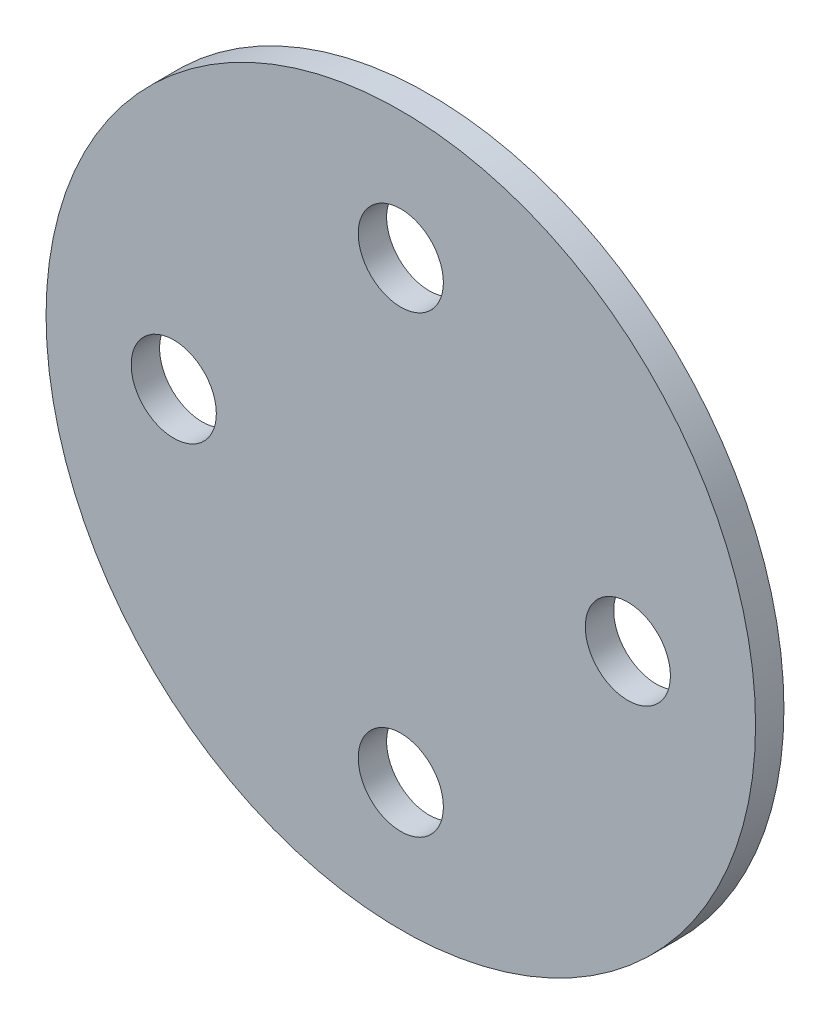
ISO-10303-21;
HEADER;
FILE_DESCRIPTION(('STEP AP214'),'2;1');
FILE_NAME('part.step','',(''),(''),'','','');
FILE_SCHEMA(('AUTOMOTIVE_DESIGN { 1 0 10303 214 1 1 1 1 }'));
ENDSEC;
DATA;
#1=APPLICATION_CONTEXT('core data for automotive mechanical design processes');
#2=APPLICATION_PROTOCOL_DEFINITION('international standard','automotive_design',2000,#1);
#3=PRODUCT_CONTEXT('',#1,'mechanical');
#4=PRODUCT('Part','Part','',(#3));
#5=PRODUCT_RELATED_PRODUCT_CATEGORY('part','',(#4));
#6=PRODUCT_DEFINITION_FORMATION('','',#4);
#7=PRODUCT_DEFINITION_CONTEXT('part definition',#1,'design');
#8=PRODUCT_DEFINITION('design','',#6,#7);
#9=PRODUCT_DEFINITION_SHAPE('','',#8);
#10=(LENGTH_UNIT() NAMED_UNIT(*) SI_UNIT(.MILLI.,.METRE.));
#11=(NAMED_UNIT(*) PLANE_ANGLE_UNIT() SI_UNIT($,.RADIAN.));
#12=(NAMED_UNIT(*) SI_UNIT($,.STERADIAN.) SOLID_ANGLE_UNIT());
#13=UNCERTAINTY_MEASURE_WITH_UNIT(LENGTH_MEASURE(1.E-05),#10,'distance_accuracy_value','');
#14=(GEOMETRIC_REPRESENTATION_CONTEXT(3) GLOBAL_UNCERTAINTY_ASSIGNED_CONTEXT((#13)) GLOBAL_UNIT_ASSIGNED_CONTEXT((#10,
#11,#12)) REPRESENTATION_CONTEXT('',''));
#15=CARTESIAN_POINT('',(0.,0.,0.));
#16=DIRECTION('',(0.,0.,1.));
#17=DIRECTION('',(1.,0.,0.));
#18=AXIS2_PLACEMENT_3D('',#15,#16,#17);
#19=CARTESIAN_POINT('',(8.,0.,1.));
#20=DIRECTION('',(0.,0.,-1.));
#21=DIRECTION('',(-1.,0.,0.));
#22=AXIS2_PLACEMENT_3D('',#19,#20,#21);
#23=CYLINDRICAL_SURFACE('',#22,1.5);
#24=CARTESIAN_POINT('',(8.,0.,1.));
#25=DIRECTION('',(0.,0.,1.));
#26=DIRECTION('',(1.,0.,0.));
#27=AXIS2_PLACEMENT_3D('',#24,#25,#26);
#28=CIRCLE('',#27,1.5);
#29=CARTESIAN_POINT('',(9.5,0.,1.));
#30=VERTEX_POINT('',#29);
#31=EDGE_CURVE('E47',#30,#30,#28,.T.);
#32=ORIENTED_EDGE('',*,*,#31,.T.);
#33=EDGE_LOOP('',(#32));
#34=FACE_BOUND('',#33,.T.);
#35=CARTESIAN_POINT('',(8.,0.,0.));
#36=DIRECTION('',(0.,0.,1.));
#37=DIRECTION('',(1.,0.,0.));
#38=AXIS2_PLACEMENT_3D('',#35,#36,#37);
#39=CIRCLE('',#38,1.5);
#40=CARTESIAN_POINT('',(9.5,0.,0.));
#41=VERTEX_POINT('',#40);
#42=EDGE_CURVE('E64',#41,#41,#39,.T.);
#43=ORIENTED_EDGE('',*,*,#42,.F.);
#44=EDGE_LOOP('',(#43));
#45=FACE_BOUND('',#44,.T.);
#46=ADVANCED_FACE('F39',(#34,#45),#23,.F.);
#47=CARTESIAN_POINT('',(0.,-8.,1.));
#48=DIRECTION('',(0.,0.,-1.));
#49=DIRECTION('',(-1.,0.,0.));
#50=AXIS2_PLACEMENT_3D('',#47,#48,#49);
#51=CYLINDRICAL_SURFACE('',#50,1.5);
#52=CARTESIAN_POINT('',(0.,-8.,1.));
#53=DIRECTION('',(0.,0.,1.));
#54=DIRECTION('',(1.,0.,0.));
#55=AXIS2_PLACEMENT_3D('',#52,#53,#54);
#56=CIRCLE('',#55,1.5);
#57=CARTESIAN_POINT('',(1.49999999999997,-8.,1.));
#58=VERTEX_POINT('',#57);
#59=EDGE_CURVE('E52',#58,#58,#56,.T.);
#60=ORIENTED_EDGE('',*,*,#59,.T.);
#61=EDGE_LOOP('',(#60));
#62=FACE_BOUND('',#61,.T.);
#63=CARTESIAN_POINT('',(0.,-8.,0.));
#64=DIRECTION('',(0.,0.,1.));
#65=DIRECTION('',(1.,0.,0.));
#66=AXIS2_PLACEMENT_3D('',#63,#64,#65);
#67=CIRCLE('',#66,1.5);
#68=CARTESIAN_POINT('',(1.49999999999997,-8.,0.));
#69=VERTEX_POINT('',#68);
#70=EDGE_CURVE('E62',#69,#69,#67,.T.);
#71=ORIENTED_EDGE('',*,*,#70,.F.);
#72=EDGE_LOOP('',(#71));
#73=FACE_BOUND('',#72,.T.);
#74=ADVANCED_FACE('F82',(#62,#73),#51,.F.);
#75=CARTESIAN_POINT('',(-8.,0.,1.));
#76=DIRECTION('',(0.,0.,-1.));
#77=DIRECTION('',(-1.,0.,0.));
#78=AXIS2_PLACEMENT_3D('',#75,#76,#77);
#79=CYLINDRICAL_SURFACE('',#78,1.5);
#80=CARTESIAN_POINT('',(-8.,0.,1.));
#81=DIRECTION('',(0.,0.,1.));
#82=DIRECTION('',(1.,0.,0.));
#83=AXIS2_PLACEMENT_3D('',#80,#81,#82);
#84=CIRCLE('',#83,1.5);
#85=CARTESIAN_POINT('',(-6.5,0.,1.));
#86=VERTEX_POINT('',#85);
#87=EDGE_CURVE('E73',#86,#86,#84,.T.);
#88=ORIENTED_EDGE('',*,*,#87,.T.);
#89=EDGE_LOOP('',(#88));
#90=FACE_BOUND('',#89,.T.);
#91=CARTESIAN_POINT('',(-8.,0.,0.));
#92=DIRECTION('',(0.,0.,1.));
#93=DIRECTION('',(1.,0.,0.));
#94=AXIS2_PLACEMENT_3D('',#91,#92,#93);
#95=CIRCLE('',#94,1.5);
#96=CARTESIAN_POINT('',(-6.5,0.,0.));
#97=VERTEX_POINT('',#96);
#98=EDGE_CURVE('E59',#97,#97,#95,.T.);
#99=ORIENTED_EDGE('',*,*,#98,.F.);
#100=EDGE_LOOP('',(#99));
#101=FACE_BOUND('',#100,.T.);
#102=ADVANCED_FACE('F100',(#90,#101),#79,.F.);
#103=CARTESIAN_POINT('',(0.,8.,1.));
#104=DIRECTION('',(0.,0.,-1.));
#105=DIRECTION('',(-1.,0.,0.));
#106=AXIS2_PLACEMENT_3D('',#103,#104,#105);
#107=CYLINDRICAL_SURFACE('',#106,1.5);
#108=CARTESIAN_POINT('',(0.,8.,1.));
#109=DIRECTION('',(0.,0.,1.));
#110=DIRECTION('',(1.,0.,0.));
#111=AXIS2_PLACEMENT_3D('',#108,#109,#110);
#112=CIRCLE('',#111,1.5);
#113=CARTESIAN_POINT('',(1.50000000000008,8.,1.));
#114=VERTEX_POINT('',#113);
#115=EDGE_CURVE('E69',#114,#114,#112,.T.);
#116=ORIENTED_EDGE('',*,*,#115,.T.);
#117=EDGE_LOOP('',(#116));
#118=FACE_BOUND('',#117,.T.);
#119=CARTESIAN_POINT('',(0.,8.,0.));
#120=DIRECTION('',(0.,0.,1.));
#121=DIRECTION('',(1.,0.,0.));
#122=AXIS2_PLACEMENT_3D('',#119,#120,#121);
#123=CIRCLE('',#122,1.5);
#124=CARTESIAN_POINT('',(1.50000000000008,8.,0.));
#125=VERTEX_POINT('',#124);
#126=EDGE_CURVE('E56',#125,#125,#123,.T.);
#127=ORIENTED_EDGE('',*,*,#126,.F.);
#128=EDGE_LOOP('',(#127));
#129=FACE_BOUND('',#128,.T.);
#130=ADVANCED_FACE('F41',(#118,#129),#107,.F.);
#131=CARTESIAN_POINT('',(0.,0.,1.));
#132=DIRECTION('',(0.,0.,-1.));
#133=DIRECTION('',(-1.,0.,0.));
#134=AXIS2_PLACEMENT_3D('',#131,#132,#133);
#135=CYLINDRICAL_SURFACE('',#134,12.5);
#136=CARTESIAN_POINT('',(0.,0.,1.));
#137=DIRECTION('',(0.,0.,1.));
#138=DIRECTION('',(1.,0.,0.));
#139=AXIS2_PLACEMENT_3D('',#136,#137,#138);
#140=CIRCLE('',#139,12.5);
#141=CARTESIAN_POINT('',(12.5,0.,1.));
#142=VERTEX_POINT('',#141);
#143=EDGE_CURVE('E10',#142,#142,#140,.T.);
#144=ORIENTED_EDGE('',*,*,#143,.F.);
#145=EDGE_LOOP('',(#144));
#146=FACE_BOUND('',#145,.T.);
#147=CARTESIAN_POINT('',(0.,0.,0.));
#148=DIRECTION('',(0.,0.,1.));
#149=DIRECTION('',(1.,0.,0.));
#150=AXIS2_PLACEMENT_3D('',#147,#148,#149);
#151=CIRCLE('',#150,12.5);
#152=CARTESIAN_POINT('',(12.5,0.,0.));
#153=VERTEX_POINT('',#152);
#154=EDGE_CURVE('E43',#153,#153,#151,.T.);
#155=ORIENTED_EDGE('',*,*,#154,.T.);
#156=EDGE_LOOP('',(#155));
#157=FACE_BOUND('',#156,.T.);
#158=ADVANCED_FACE('F89',(#146,#157),#135,.T.);
#159=CARTESIAN_POINT('',(0.,0.,1.));
#160=DIRECTION('',(0.,0.,1.));
#161=DIRECTION('',(1.,0.,0.));
#162=AXIS2_PLACEMENT_3D('',#159,#160,#161);
#163=PLANE('',#162);
#164=ORIENTED_EDGE('',*,*,#115,.F.);
#165=EDGE_LOOP('',(#164));
#166=FACE_BOUND('',#165,.T.);
#167=ORIENTED_EDGE('',*,*,#87,.F.);
#168=EDGE_LOOP('',(#167));
#169=FACE_BOUND('',#168,.T.);
#170=ORIENTED_EDGE('',*,*,#59,.F.);
#171=EDGE_LOOP('',(#170));
#172=FACE_BOUND('',#171,.T.);
#173=ORIENTED_EDGE('',*,*,#31,.F.);
#174=EDGE_LOOP('',(#173));
#175=FACE_BOUND('',#174,.T.);
#176=ORIENTED_EDGE('',*,*,#143,.T.);
#177=EDGE_LOOP('',(#176));
#178=FACE_BOUND('',#177,.T.);
#179=ADVANCED_FACE('F85',(#166,#169,#172,#175,#178),#163,.T.);
#180=CARTESIAN_POINT('',(0.,0.,0.));
#181=DIRECTION('',(0.,0.,1.));
#182=DIRECTION('',(1.,0.,0.));
#183=AXIS2_PLACEMENT_3D('',#180,#181,#182);
#184=PLANE('',#183);
#185=ORIENTED_EDGE('',*,*,#126,.T.);
#186=EDGE_LOOP('',(#185));
#187=FACE_BOUND('',#186,.T.);
#188=ORIENTED_EDGE('',*,*,#98,.T.);
#189=EDGE_LOOP('',(#188));
#190=FACE_BOUND('',#189,.T.);
#191=ORIENTED_EDGE('',*,*,#70,.T.);
#192=EDGE_LOOP('',(#191));
#193=FACE_BOUND('',#192,.T.);
#194=ORIENTED_EDGE('',*,*,#42,.T.);
#195=EDGE_LOOP('',(#194));
#196=FACE_BOUND('',#195,.T.);
#197=ORIENTED_EDGE('',*,*,#154,.F.);
#198=EDGE_LOOP('',(#197));
#199=FACE_BOUND('',#198,.T.);
#200=ADVANCED_FACE('F88',(#187,#190,#193,#196,#199),#184,.F.);
#201=CLOSED_SHELL('',(#46,#74,#102,#130,#158,#179,#200));
#202=MANIFOLD_SOLID_BREP('B2',#201);
#203=ADVANCED_BREP_SHAPE_REPRESENTATION('',(#18,#202),#14);
#204=SHAPE_DEFINITION_REPRESENTATION(#9,#203);
ENDSEC;
END-ISO-10303-21;
